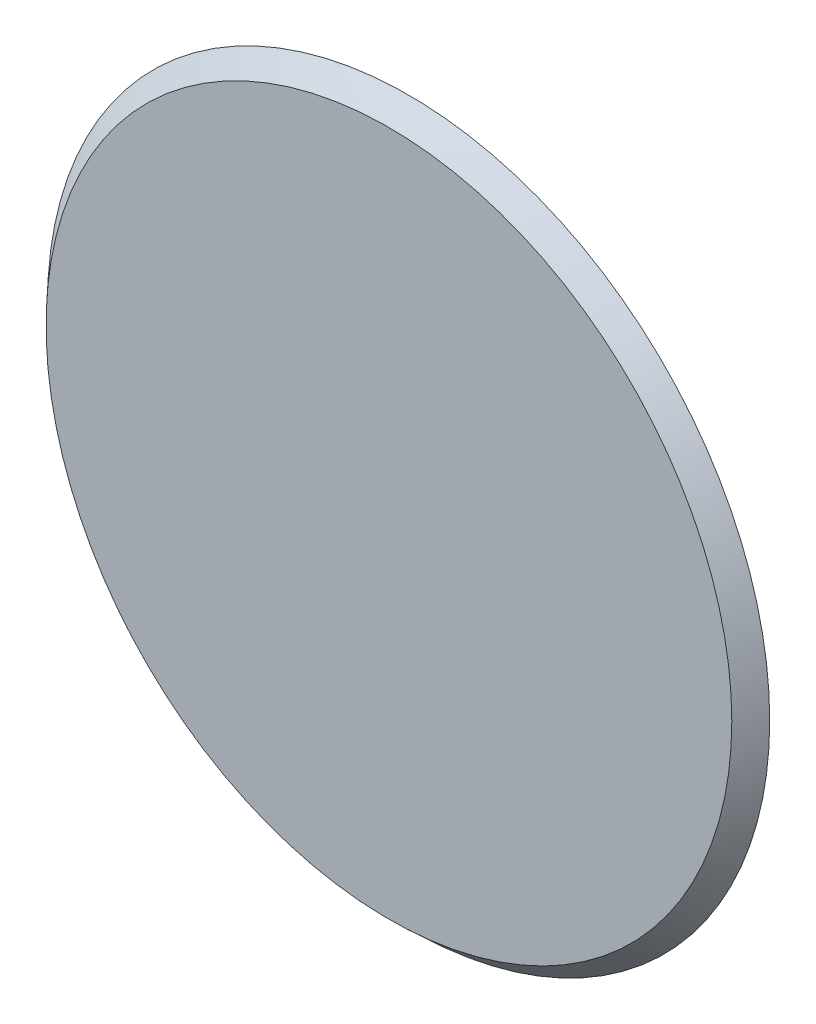
ISO-10303-21;
HEADER;
FILE_DESCRIPTION(('STEP AP214'),'2;1');
FILE_NAME('part.step','',(''),(''),'','','');
FILE_SCHEMA(('AUTOMOTIVE_DESIGN { 1 0 10303 214 1 1 1 1 }'));
ENDSEC;
DATA;
#1=APPLICATION_CONTEXT('core data for automotive mechanical design processes');
#2=APPLICATION_PROTOCOL_DEFINITION('international standard','automotive_design',2000,#1);
#3=PRODUCT_CONTEXT('',#1,'mechanical');
#4=PRODUCT('Part','Part','',(#3));
#5=PRODUCT_RELATED_PRODUCT_CATEGORY('part','',(#4));
#6=PRODUCT_DEFINITION_FORMATION('','',#4);
#7=PRODUCT_DEFINITION_CONTEXT('part definition',#1,'design');
#8=PRODUCT_DEFINITION('design','',#6,#7);
#9=PRODUCT_DEFINITION_SHAPE('','',#8);
#10=(LENGTH_UNIT() NAMED_UNIT(*) SI_UNIT(.MILLI.,.METRE.));
#11=(NAMED_UNIT(*) PLANE_ANGLE_UNIT() SI_UNIT($,.RADIAN.));
#12=(NAMED_UNIT(*) SI_UNIT($,.STERADIAN.) SOLID_ANGLE_UNIT());
#13=UNCERTAINTY_MEASURE_WITH_UNIT(LENGTH_MEASURE(1.E-05),#10,'distance_accuracy_value','');
#14=(GEOMETRIC_REPRESENTATION_CONTEXT(3) GLOBAL_UNCERTAINTY_ASSIGNED_CONTEXT((#13)) GLOBAL_UNIT_ASSIGNED_CONTEXT((#10,
#11,#12)) REPRESENTATION_CONTEXT('',''));
#15=CARTESIAN_POINT('',(0.,0.,0.));
#16=DIRECTION('',(0.,0.,1.));
#17=DIRECTION('',(1.,0.,0.));
#18=AXIS2_PLACEMENT_3D('',#15,#16,#17);
#19=CARTESIAN_POINT('',(0.,0.,1.));
#20=DIRECTION('',(0.,0.,1.));
#21=DIRECTION('',(1.,0.,0.));
#22=AXIS2_PLACEMENT_3D('',#19,#20,#21);
#23=SPHERICAL_SURFACE('',#22,1000.);
#24=CARTESIAN_POINT('',(0.,0.,701.));
#25=DIRECTION('',(0.,0.,1.));
#26=DIRECTION('',(1.,0.,0.));
#27=AXIS2_PLACEMENT_3D('',#24,#25,#26);
#28=CIRCLE('',#27,714.142842854285);
#29=CARTESIAN_POINT('',(714.142842854285,0.,701.));
#30=VERTEX_POINT('',#29);
#31=EDGE_CURVE('E10',#30,#30,#28,.F.);
#32=CARTESIAN_POINT('',(0.,0.,660.));
#33=DIRECTION('',(0.,0.,-1.));
#34=DIRECTION('',(-1.,0.,0.));
#35=AXIS2_PLACEMENT_3D('',#32,#33,#34);
#36=CIRCLE('',#35,752.142938542934);
#37=CARTESIAN_POINT('',(752.142938542934,0.,660.));
#38=VERTEX_POINT('',#37);
#39=EDGE_CURVE('E40',#38,#38,#36,.F.);
#40=CARTESIAN_POINT('',(714.142842854285,0.,701.));
#41=CARTESIAN_POINT('',(714.550512981301,0.,700.584093281577));
#42=CARTESIAN_POINT('',(714.957819780223,0.,700.167830430391));
#43=CARTESIAN_POINT('',(715.771705480304,0.,699.334593734872));
#44=CARTESIAN_POINT('',(716.178284381463,0.,698.917619890539));
#45=CARTESIAN_POINT('',(716.990713044443,0.,698.082962481104));
#46=CARTESIAN_POINT('',(717.396562806264,0.,697.665278916002));
#47=CARTESIAN_POINT('',(718.207531951812,0.,696.829203340156));
#48=CARTESIAN_POINT('',(718.61265133554,0.,696.410811329412));
#49=CARTESIAN_POINT('',(719.422158488217,0.,695.573320139416));
#50=CARTESIAN_POINT('',(719.826546257166,0.,695.154220960164));
#51=CARTESIAN_POINT('',(720.634588945879,0.,694.315316712485));
#52=CARTESIAN_POINT('',(721.038243865642,0.,693.895511644058));
#53=CARTESIAN_POINT('',(721.8448196238,0.,693.055196899507));
#54=CARTESIAN_POINT('',(722.247740462194,0.,692.634687223383));
#55=CARTESIAN_POINT('',(723.052846827673,0.,691.792964547069));
#56=CARTESIAN_POINT('',(723.455032354758,0.,691.371751546879));
#57=CARTESIAN_POINT('',(724.258666869926,0.,690.528623508211));
#58=CARTESIAN_POINT('',(724.660115858008,0.,690.106708469733));
#59=CARTESIAN_POINT('',(725.462276069721,0.,689.262177642409));
#60=CARTESIAN_POINT('',(725.862987293352,0.,688.839561853563));
#61=CARTESIAN_POINT('',(726.66367075297,0.,687.993630815563));
#62=CARTESIAN_POINT('',(727.063642988956,0.,687.57031556641));
#63=CARTESIAN_POINT('',(727.862847252344,0.,686.722986899989));
#64=CARTESIAN_POINT('',(728.262079279746,0.,686.298973482722));
#65=CARTESIAN_POINT('',(729.059801907286,0.,685.4502497744));
#66=CARTESIAN_POINT('',(729.458292507425,0.,685.025539483346));
#67=CARTESIAN_POINT('',(730.254531064022,0.,684.175423323904));
#68=CARTESIAN_POINT('',(730.652279020481,0.,683.750017455516));
#69=CARTESIAN_POINT('',(731.44703107557,0.,682.898511439984));
#70=CARTESIAN_POINT('',(731.8440351742,0.,682.472411292839));
#71=CARTESIAN_POINT('',(732.637298301752,0.,681.619518020487));
#72=CARTESIAN_POINT('',(733.033557330675,0.,681.192724895281));
#73=CARTESIAN_POINT('',(733.825329109208,0.,680.338446969618));
#74=CARTESIAN_POINT('',(734.220841858819,0.,679.910962169162));
#75=CARTESIAN_POINT('',(735.011119871404,0.,679.055302197923));
#76=CARTESIAN_POINT('',(735.405885134377,0.,678.627127027139));
#77=CARTESIAN_POINT('',(736.194666968642,0.,677.770087622275));
#78=CARTESIAN_POINT('',(736.588683539933,0.,677.341223388194));
#79=CARTESIAN_POINT('',(737.375966788076,0.,676.482807165868));
#80=CARTESIAN_POINT('',(737.769233464926,0.,676.053255177624));
#81=CARTESIAN_POINT('',(738.555015723717,0.,675.193464758204));
#82=CARTESIAN_POINT('',(738.947531305657,0.,674.763226327028));
#83=CARTESIAN_POINT('',(739.731810176449,0.,673.902064335075));
#84=CARTESIAN_POINT('',(740.123573465301,0.,673.471140774297));
#85=CARTESIAN_POINT('',(740.906346554037,0.,672.608609838558));
#86=CARTESIAN_POINT('',(741.297356353921,0.,672.177002463597));
#87=CARTESIAN_POINT('',(742.07862127114,0.,671.313105216999));
#88=CARTESIAN_POINT('',(742.468876388475,0.,670.880815345362));
#89=CARTESIAN_POINT('',(743.248630749319,0.,670.015554425003));
#90=CARTESIAN_POINT('',(743.638129992828,0.,669.58258337628));
#91=CARTESIAN_POINT('',(744.416371417051,0.,668.71596142342));
#92=CARTESIAN_POINT('',(744.805113597765,0.,668.282310519282));
#93=CARTESIAN_POINT('',(745.581839709739,0.,667.414330179335));
#94=CARTESIAN_POINT('',(745.969823640999,0.,666.980000743526));
#95=CARTESIAN_POINT('',(746.745032069723,0.,666.110664666055));
#96=CARTESIAN_POINT('',(747.132256567187,0.,665.675658024393));
#97=CARTESIAN_POINT('',(747.905944946284,0.,664.804968863093));
#98=CARTESIAN_POINT('',(748.292408827917,0.,664.369286343454));
#99=CARTESIAN_POINT('',(749.064574795684,0.,663.497246756176));
#100=CARTESIAN_POINT('',(749.450276881818,0.,663.060889688537));
#101=CARTESIAN_POINT('',(750.220918081075,0.,662.18750233715));
#102=CARTESIAN_POINT('',(750.605857194199,0.,661.750472053402));
#103=CARTESIAN_POINT('',(751.37497127288,0.,660.875739604289));
#104=CARTESIAN_POINT('',(751.759146238438,0.,660.438037438925));
#105=CARTESIAN_POINT('',(752.142938542934,0.,660.));
#106=B_SPLINE_CURVE_WITH_KNOTS('',3,(#40,#41,#42,#43,#44,#45,#46,#47,#48,#49,#50,#51,#52,#53,
#54,#55,#56,#57,#58,#59,#60,#61,#62,#63,#64,#65,#66,#67,#68,#69,#70,#71,#72,#73,#74,#75,#76,#77,
#78,#79,#80,#81,#82,#83,#84,#85,#86,#87,#88,#89,#90,#91,#92,#93,#94,#95,#96,#97,#98,#99,#100,
#101,#102,#103,#104,#105),.UNSPECIFIED.,.F.,.F.,(4,2,2,2,2,2,2,2,2,2,2,2,2,2,2,2,2,2,2,2,2,2,2,
2,2,2,2,2,2,2,2,2,4),(0.,1.74715746327909,3.49431492655828,5.24147238983762,6.98862985311682,
8.73578731639595,10.4829447796753,12.2301022429545,13.9772597062336,15.7244171695128,
17.471574632792,19.2187320960712,20.9658895593504,22.7130470226296,24.460204485909,
26.2073619491881,27.9545194124672,29.7016768757464,31.4488343390256,33.195991802305,
34.9431492655841,36.6903067288632,38.4374641921425,40.1846216554218,41.9317791187009,
43.6789365819801,45.4260940452593,47.1732515085386,48.9204089718177,50.6675664350969,
52.4147238983762,54.1618813616555,55.9090388249346),.UNSPECIFIED.);
#107=EDGE_CURVE('BSEAM37',#30,#38,#106,.T.);
#108=ORIENTED_EDGE('',*,*,#31,.T.);
#109=ORIENTED_EDGE('',*,*,#39,.T.);
#110=ORIENTED_EDGE('',*,*,#107,.T.);
#111=ORIENTED_EDGE('',*,*,#107,.F.);
#112=EDGE_LOOP('',(#108,#110,#109,#111));
#113=FACE_BOUND('',#112,.T.);
#114=ADVANCED_FACE('F37',(#113),#23,.T.);
#115=CARTESIAN_POINT('',(0.,0.,701.));
#116=DIRECTION('',(0.,0.,1.));
#117=DIRECTION('',(1.,0.,0.));
#118=AXIS2_PLACEMENT_3D('',#115,#116,#117);
#119=PLANE('',#118);
#120=ORIENTED_EDGE('',*,*,#31,.F.);
#121=EDGE_LOOP('',(#120));
#122=FACE_BOUND('',#121,.T.);
#123=ADVANCED_FACE('F54',(#122),#119,.T.);
#124=CARTESIAN_POINT('',(0.,0.,660.));
#125=DIRECTION('',(0.,0.,-1.));
#126=DIRECTION('',(-1.,0.,0.));
#127=AXIS2_PLACEMENT_3D('',#124,#125,#126);
#128=PLANE('',#127);
#129=ORIENTED_EDGE('',*,*,#39,.F.);
#130=EDGE_LOOP('',(#129));
#131=FACE_BOUND('',#130,.T.);
#132=ADVANCED_FACE('F52',(#131),#128,.T.);
#133=CLOSED_SHELL('',(#114,#123,#132));
#134=MANIFOLD_SOLID_BREP('B2',#133);
#135=ADVANCED_BREP_SHAPE_REPRESENTATION('',(#18,#134),#14);
#136=SHAPE_DEFINITION_REPRESENTATION(#9,#135);
ENDSEC;
END-ISO-10303-21;
